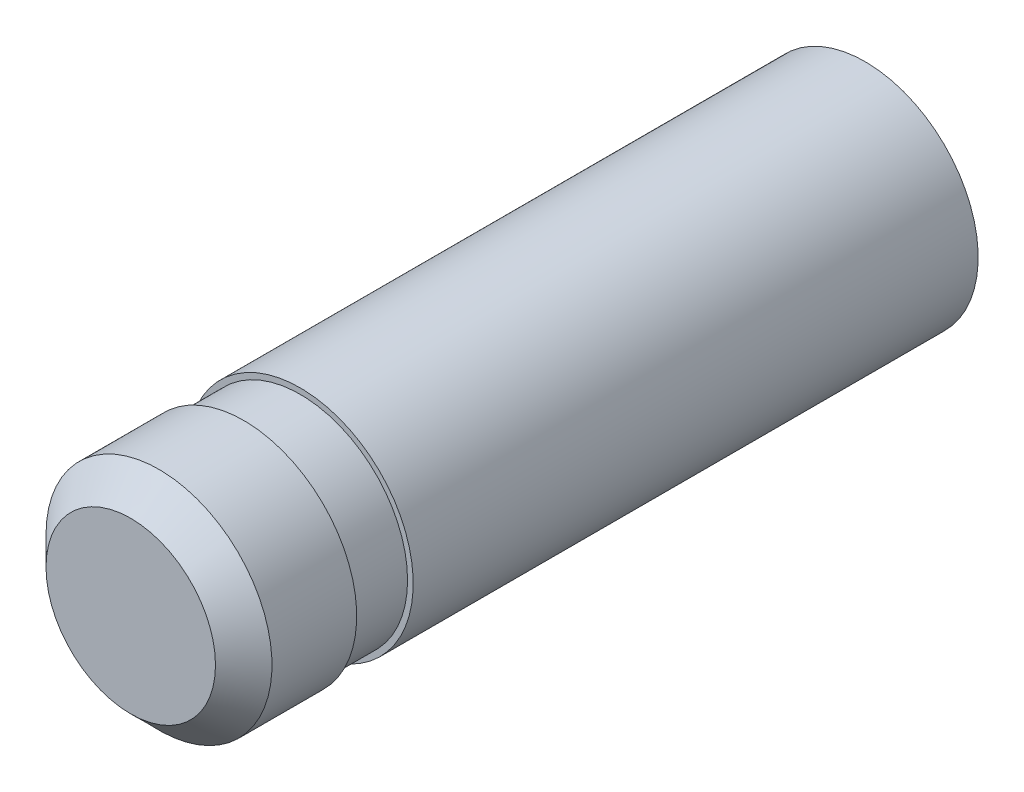
ISO-10303-21;
HEADER;
FILE_DESCRIPTION(('STEP AP214'),'2;1');
FILE_NAME('part.step','',(''),(''),'','','');
FILE_SCHEMA(('AUTOMOTIVE_DESIGN { 1 0 10303 214 1 1 1 1 }'));
ENDSEC;
DATA;
#1=APPLICATION_CONTEXT('core data for automotive mechanical design processes');
#2=APPLICATION_PROTOCOL_DEFINITION('international standard','automotive_design',2000,#1);
#3=PRODUCT_CONTEXT('',#1,'mechanical');
#4=PRODUCT('Part','Part','',(#3));
#5=PRODUCT_RELATED_PRODUCT_CATEGORY('part','',(#4));
#6=PRODUCT_DEFINITION_FORMATION('','',#4);
#7=PRODUCT_DEFINITION_CONTEXT('part definition',#1,'design');
#8=PRODUCT_DEFINITION('design','',#6,#7);
#9=PRODUCT_DEFINITION_SHAPE('','',#8);
#10=(LENGTH_UNIT() NAMED_UNIT(*) SI_UNIT(.MILLI.,.METRE.));
#11=(NAMED_UNIT(*) PLANE_ANGLE_UNIT() SI_UNIT($,.RADIAN.));
#12=(NAMED_UNIT(*) SI_UNIT($,.STERADIAN.) SOLID_ANGLE_UNIT());
#13=UNCERTAINTY_MEASURE_WITH_UNIT(LENGTH_MEASURE(1.E-05),#10,'distance_accuracy_value','');
#14=(GEOMETRIC_REPRESENTATION_CONTEXT(3) GLOBAL_UNCERTAINTY_ASSIGNED_CONTEXT((#13)) GLOBAL_UNIT_ASSIGNED_CONTEXT((#10,
#11,#12)) REPRESENTATION_CONTEXT('',''));
#15=CARTESIAN_POINT('',(0.,0.,0.));
#16=DIRECTION('',(0.,0.,1.));
#17=DIRECTION('',(1.,0.,0.));
#18=AXIS2_PLACEMENT_3D('',#15,#16,#17);
#19=CARTESIAN_POINT('',(0.,0.,16.2936060245675));
#20=DIRECTION('',(0.,0.,-1.));
#21=DIRECTION('',(-1.,0.,0.));
#22=AXIS2_PLACEMENT_3D('',#19,#20,#21);
#23=CYLINDRICAL_SURFACE('',#22,3.);
#24=CARTESIAN_POINT('',(0.,0.,15.5436060245675));
#25=DIRECTION('',(0.,0.,1.));
#26=DIRECTION('',(1.,0.,0.));
#27=AXIS2_PLACEMENT_3D('',#24,#25,#26);
#28=CIRCLE('',#27,3.);
#29=CARTESIAN_POINT('',(-3.,0.,15.5436060245675));
#30=VERTEX_POINT('',#29);
#31=EDGE_CURVE('E11',#30,#30,#28,.F.);
#32=CARTESIAN_POINT('',(0.,0.,13.2936060245675));
#33=DIRECTION('',(0.,0.,-1.));
#34=DIRECTION('',(-1.,0.,0.));
#35=AXIS2_PLACEMENT_3D('',#32,#33,#34);
#36=CIRCLE('',#35,3.);
#37=CARTESIAN_POINT('',(-3.,0.,13.2936060245675));
#38=VERTEX_POINT('',#37);
#39=EDGE_CURVE('E50',#38,#38,#36,.T.);
#40=CARTESIAN_POINT('',(-3.,0.,15.5436060245675));
#41=CARTESIAN_POINT('',(-3.,0.,15.5201685245675));
#42=CARTESIAN_POINT('',(-3.,0.,15.4967310245675));
#43=CARTESIAN_POINT('',(-3.,0.,15.4498560245675));
#44=CARTESIAN_POINT('',(-3.,0.,15.4264185245675));
#45=CARTESIAN_POINT('',(-3.,0.,15.3795435245675));
#46=CARTESIAN_POINT('',(-3.,0.,15.3561060245675));
#47=CARTESIAN_POINT('',(-3.,0.,15.3092310245675));
#48=CARTESIAN_POINT('',(-3.,0.,15.2857935245675));
#49=CARTESIAN_POINT('',(-3.,0.,15.2389185245675));
#50=CARTESIAN_POINT('',(-3.,0.,15.2154810245675));
#51=CARTESIAN_POINT('',(-3.,0.,15.1686060245675));
#52=CARTESIAN_POINT('',(-3.,0.,15.1451685245675));
#53=CARTESIAN_POINT('',(-3.,0.,15.0982935245675));
#54=CARTESIAN_POINT('',(-3.,0.,15.0748560245675));
#55=CARTESIAN_POINT('',(-3.,0.,15.0279810245675));
#56=CARTESIAN_POINT('',(-3.,0.,15.0045435245675));
#57=CARTESIAN_POINT('',(-3.,0.,14.9576685245675));
#58=CARTESIAN_POINT('',(-3.,0.,14.9342310245675));
#59=CARTESIAN_POINT('',(-3.,0.,14.8873560245675));
#60=CARTESIAN_POINT('',(-3.,0.,14.8639185245675));
#61=CARTESIAN_POINT('',(-3.,0.,14.8170435245675));
#62=CARTESIAN_POINT('',(-3.,0.,14.7936060245675));
#63=CARTESIAN_POINT('',(-3.,0.,14.7467310245675));
#64=CARTESIAN_POINT('',(-3.,0.,14.7232935245675));
#65=CARTESIAN_POINT('',(-3.,0.,14.6764185245675));
#66=CARTESIAN_POINT('',(-3.,0.,14.6529810245675));
#67=CARTESIAN_POINT('',(-3.,0.,14.6061060245675));
#68=CARTESIAN_POINT('',(-3.,0.,14.5826685245675));
#69=CARTESIAN_POINT('',(-3.,0.,14.5357935245675));
#70=CARTESIAN_POINT('',(-3.,0.,14.5123560245675));
#71=CARTESIAN_POINT('',(-3.,0.,14.4654810245675));
#72=CARTESIAN_POINT('',(-3.,0.,14.4420435245675));
#73=CARTESIAN_POINT('',(-3.,0.,14.3951685245675));
#74=CARTESIAN_POINT('',(-3.,0.,14.3717310245675));
#75=CARTESIAN_POINT('',(-3.,0.,14.3248560245675));
#76=CARTESIAN_POINT('',(-3.,0.,14.3014185245675));
#77=CARTESIAN_POINT('',(-3.,0.,14.2545435245675));
#78=CARTESIAN_POINT('',(-3.,0.,14.2311060245675));
#79=CARTESIAN_POINT('',(-3.,0.,14.1842310245675));
#80=CARTESIAN_POINT('',(-3.,0.,14.1607935245675));
#81=CARTESIAN_POINT('',(-3.,0.,14.1139185245675));
#82=CARTESIAN_POINT('',(-3.,0.,14.0904810245675));
#83=CARTESIAN_POINT('',(-3.,0.,14.0436060245675));
#84=CARTESIAN_POINT('',(-3.,0.,14.0201685245675));
#85=CARTESIAN_POINT('',(-3.,0.,13.9732935245675));
#86=CARTESIAN_POINT('',(-3.,0.,13.9498560245675));
#87=CARTESIAN_POINT('',(-3.,0.,13.9029810245675));
#88=CARTESIAN_POINT('',(-3.,0.,13.8795435245675));
#89=CARTESIAN_POINT('',(-3.,0.,13.8326685245675));
#90=CARTESIAN_POINT('',(-3.,0.,13.8092310245675));
#91=CARTESIAN_POINT('',(-3.,0.,13.7623560245675));
#92=CARTESIAN_POINT('',(-3.,0.,13.7389185245675));
#93=CARTESIAN_POINT('',(-3.,0.,13.6920435245675));
#94=CARTESIAN_POINT('',(-3.,0.,13.6686060245675));
#95=CARTESIAN_POINT('',(-3.,0.,13.6217310245675));
#96=CARTESIAN_POINT('',(-3.,0.,13.5982935245675));
#97=CARTESIAN_POINT('',(-3.,0.,13.5514185245675));
#98=CARTESIAN_POINT('',(-3.,0.,13.5279810245675));
#99=CARTESIAN_POINT('',(-3.,0.,13.4811060245675));
#100=CARTESIAN_POINT('',(-3.,0.,13.4576685245675));
#101=CARTESIAN_POINT('',(-3.,0.,13.4107935245675));
#102=CARTESIAN_POINT('',(-3.,0.,13.3873560245675));
#103=CARTESIAN_POINT('',(-3.,0.,13.3404810245675));
#104=CARTESIAN_POINT('',(-3.,0.,13.3170435245675));
#105=CARTESIAN_POINT('',(-3.,0.,13.2936060245675));
#106=B_SPLINE_CURVE_WITH_KNOTS('',3,(#40,#41,#42,#43,#44,#45,#46,#47,#48,#49,#50,#51,#52,#53,
#54,#55,#56,#57,#58,#59,#60,#61,#62,#63,#64,#65,#66,#67,#68,#69,#70,#71,#72,#73,#74,#75,#76,#77,
#78,#79,#80,#81,#82,#83,#84,#85,#86,#87,#88,#89,#90,#91,#92,#93,#94,#95,#96,#97,#98,#99,#100,
#101,#102,#103,#104,#105),.UNSPECIFIED.,.F.,.F.,(4,2,2,2,2,2,2,2,2,2,2,2,2,2,2,2,2,2,2,2,2,2,2,
2,2,2,2,2,2,2,2,2,4),(0.,0.0703124999999992,0.140625,0.210937499999999,0.28125,
0.351562499999999,0.421875,0.4921875,0.5625,0.6328125,0.703125000000001,0.7734375,
0.843750000000001,0.9140625,0.984375000000001,1.0546875,1.125,1.1953125,1.265625,1.3359375,
1.40625,1.4765625,1.546875,1.6171875,1.6875,1.7578125,1.828125,1.8984375,1.96875,2.0390625,
2.109375,2.1796875,2.25),.UNSPECIFIED.);
#107=EDGE_CURVE('BSEAM35',#30,#38,#106,.T.);
#108=ORIENTED_EDGE('',*,*,#31,.T.);
#109=ORIENTED_EDGE('',*,*,#39,.F.);
#110=ORIENTED_EDGE('',*,*,#107,.T.);
#111=ORIENTED_EDGE('',*,*,#107,.F.);
#112=EDGE_LOOP('',(#108,#110,#109,#111));
#113=FACE_BOUND('',#112,.T.);
#114=ADVANCED_FACE('F35',(#113),#23,.T.);
#115=CARTESIAN_POINT('',(0.,0.,16.2936060245675));
#116=DIRECTION('',(0.,0.,1.));
#117=DIRECTION('',(1.,0.,0.));
#118=AXIS2_PLACEMENT_3D('',#115,#116,#117);
#119=PLANE('',#118);
#120=CARTESIAN_POINT('',(0.,0.,16.2936060245675));
#121=DIRECTION('',(0.,0.,1.));
#122=DIRECTION('',(1.,0.,0.));
#123=AXIS2_PLACEMENT_3D('',#120,#121,#122);
#124=CIRCLE('',#123,2.25000000000001);
#125=CARTESIAN_POINT('',(2.25000000000001,0.,16.2936060245675));
#126=VERTEX_POINT('',#125);
#127=EDGE_CURVE('E42',#126,#126,#124,.T.);
#128=ORIENTED_EDGE('',*,*,#127,.T.);
#129=EDGE_LOOP('',(#128));
#130=FACE_BOUND('',#129,.T.);
#131=ADVANCED_FACE('F72',(#130),#119,.T.);
#132=CARTESIAN_POINT('',(0.,0.,13.2936060245675));
#133=DIRECTION('',(0.,0.,-1.));
#134=DIRECTION('',(-1.,0.,0.));
#135=AXIS2_PLACEMENT_3D('',#132,#133,#134);
#136=PLANE('',#135);
#137=CARTESIAN_POINT('',(0.,0.,13.2936060245675));
#138=DIRECTION('',(0.,0.,-1.));
#139=DIRECTION('',(-1.,0.,0.));
#140=AXIS2_PLACEMENT_3D('',#137,#138,#139);
#141=CIRCLE('',#140,2.85);
#142=CARTESIAN_POINT('',(-2.85,0.,13.2936060245675));
#143=VERTEX_POINT('',#142);
#144=EDGE_CURVE('E57',#143,#143,#141,.T.);
#145=ORIENTED_EDGE('',*,*,#144,.F.);
#146=EDGE_LOOP('',(#145));
#147=FACE_BOUND('',#146,.T.);
#148=ORIENTED_EDGE('',*,*,#39,.T.);
#149=EDGE_LOOP('',(#148));
#150=FACE_BOUND('',#149,.T.);
#151=ADVANCED_FACE('F68',(#147,#150),#136,.T.);
#152=CARTESIAN_POINT('',(0.,0.,11.7936060245675));
#153=DIRECTION('',(0.,0.,-1.));
#154=DIRECTION('',(-1.,0.,0.));
#155=AXIS2_PLACEMENT_3D('',#152,#153,#154);
#156=PLANE('',#155);
#157=CARTESIAN_POINT('',(0.,0.,11.7936060245675));
#158=DIRECTION('',(0.,0.,-1.));
#159=DIRECTION('',(-1.,0.,0.));
#160=AXIS2_PLACEMENT_3D('',#157,#158,#159);
#161=CIRCLE('',#160,2.85);
#162=CARTESIAN_POINT('',(-2.85,0.,11.7936060245675));
#163=VERTEX_POINT('',#162);
#164=EDGE_CURVE('E59',#163,#163,#161,.T.);
#165=ORIENTED_EDGE('',*,*,#164,.T.);
#166=EDGE_LOOP('',(#165));
#167=FACE_BOUND('',#166,.T.);
#168=CARTESIAN_POINT('',(0.,0.,11.7936060245675));
#169=DIRECTION('',(0.,0.,-1.));
#170=DIRECTION('',(-1.,0.,0.));
#171=AXIS2_PLACEMENT_3D('',#168,#169,#170);
#172=CIRCLE('',#171,3.);
#173=CARTESIAN_POINT('',(-3.,0.,11.7936060245675));
#174=VERTEX_POINT('',#173);
#175=EDGE_CURVE('E55',#174,#174,#172,.T.);
#176=ORIENTED_EDGE('',*,*,#175,.F.);
#177=EDGE_LOOP('',(#176));
#178=FACE_BOUND('',#177,.T.);
#179=ADVANCED_FACE('F71',(#167,#178),#156,.F.);
#180=CARTESIAN_POINT('',(0.,0.,13.2936060245675));
#181=DIRECTION('',(0.,0.,-1.));
#182=DIRECTION('',(-1.,0.,0.));
#183=AXIS2_PLACEMENT_3D('',#180,#181,#182);
#184=CYLINDRICAL_SURFACE('',#183,2.85);
#185=ORIENTED_EDGE('',*,*,#144,.T.);
#186=EDGE_LOOP('',(#185));
#187=FACE_BOUND('',#186,.T.);
#188=ORIENTED_EDGE('',*,*,#164,.F.);
#189=EDGE_LOOP('',(#188));
#190=FACE_BOUND('',#189,.T.);
#191=ADVANCED_FACE('F65',(#187,#190),#184,.T.);
#192=CARTESIAN_POINT('',(0.,0.,-3.20639397543254));
#193=DIRECTION('',(0.,0.,1.));
#194=DIRECTION('',(1.,0.,0.));
#195=AXIS2_PLACEMENT_3D('',#192,#193,#194);
#196=PLANE('',#195);
#197=CARTESIAN_POINT('',(0.,0.,-3.20639397543254));
#198=DIRECTION('',(0.,0.,1.));
#199=DIRECTION('',(1.,0.,0.));
#200=AXIS2_PLACEMENT_3D('',#197,#198,#199);
#201=CIRCLE('',#200,3.);
#202=CARTESIAN_POINT('',(-3.,0.,-3.20639397543254));
#203=VERTEX_POINT('',#202);
#204=EDGE_CURVE('E46',#203,#203,#201,.T.);
#205=ORIENTED_EDGE('',*,*,#204,.F.);
#206=EDGE_LOOP('',(#205));
#207=FACE_BOUND('',#206,.T.);
#208=ADVANCED_FACE('F84',(#207),#196,.F.);
#209=CARTESIAN_POINT('',(-3.,0.,11.7936060245675));
#210=CARTESIAN_POINT('',(-3.,0.,11.6373560245675));
#211=CARTESIAN_POINT('',(-3.,0.,11.4811060245675));
#212=CARTESIAN_POINT('',(-3.,0.,11.1686060245675));
#213=CARTESIAN_POINT('',(-3.,0.,11.0123560245675));
#214=CARTESIAN_POINT('',(-3.,0.,10.6998560245675));
#215=CARTESIAN_POINT('',(-3.,0.,10.5436060245675));
#216=CARTESIAN_POINT('',(-3.,0.,10.2311060245675));
#217=CARTESIAN_POINT('',(-3.,0.,10.0748560245675));
#218=CARTESIAN_POINT('',(-3.,0.,9.76235602456746));
#219=CARTESIAN_POINT('',(-3.,0.,9.60610602456746));
#220=CARTESIAN_POINT('',(-3.,0.,9.29360602456746));
#221=CARTESIAN_POINT('',(-3.,0.,9.13735602456746));
#222=CARTESIAN_POINT('',(-3.,0.,8.82485602456746));
#223=CARTESIAN_POINT('',(-3.,0.,8.66860602456746));
#224=CARTESIAN_POINT('',(-3.,0.,8.35610602456746));
#225=CARTESIAN_POINT('',(-3.,0.,8.19985602456746));
#226=CARTESIAN_POINT('',(-3.,0.,7.88735602456746));
#227=CARTESIAN_POINT('',(-3.,0.,7.73110602456746));
#228=CARTESIAN_POINT('',(-3.,0.,7.41860602456746));
#229=CARTESIAN_POINT('',(-3.,0.,7.26235602456746));
#230=CARTESIAN_POINT('',(-3.,0.,6.94985602456746));
#231=CARTESIAN_POINT('',(-3.,0.,6.79360602456746));
#232=CARTESIAN_POINT('',(-3.,0.,6.48110602456746));
#233=CARTESIAN_POINT('',(-3.,0.,6.32485602456746));
#234=CARTESIAN_POINT('',(-3.,0.,6.01235602456746));
#235=CARTESIAN_POINT('',(-3.,0.,5.85610602456746));
#236=CARTESIAN_POINT('',(-3.,0.,5.54360602456746));
#237=CARTESIAN_POINT('',(-3.,0.,5.38735602456746));
#238=CARTESIAN_POINT('',(-3.,0.,5.07485602456746));
#239=CARTESIAN_POINT('',(-3.,0.,4.91860602456746));
#240=CARTESIAN_POINT('',(-3.,0.,4.60610602456746));
#241=CARTESIAN_POINT('',(-3.,0.,4.44985602456746));
#242=CARTESIAN_POINT('',(-3.,0.,4.13735602456746));
#243=CARTESIAN_POINT('',(-3.,0.,3.98110602456746));
#244=CARTESIAN_POINT('',(-3.,0.,3.66860602456746));
#245=CARTESIAN_POINT('',(-3.,0.,3.51235602456746));
#246=CARTESIAN_POINT('',(-3.,0.,3.19985602456746));
#247=CARTESIAN_POINT('',(-3.,0.,3.04360602456746));
#248=CARTESIAN_POINT('',(-3.,0.,2.73110602456746));
#249=CARTESIAN_POINT('',(-3.,0.,2.57485602456746));
#250=CARTESIAN_POINT('',(-3.,0.,2.26235602456746));
#251=CARTESIAN_POINT('',(-3.,0.,2.10610602456746));
#252=CARTESIAN_POINT('',(-3.,0.,1.79360602456746));
#253=CARTESIAN_POINT('',(-3.,0.,1.63735602456746));
#254=CARTESIAN_POINT('',(-3.,0.,1.32485602456746));
#255=CARTESIAN_POINT('',(-3.,0.,1.16860602456746));
#256=CARTESIAN_POINT('',(-3.,0.,0.856106024567463));
#257=CARTESIAN_POINT('',(-3.,0.,0.699856024567464));
#258=CARTESIAN_POINT('',(-3.,0.,0.387356024567463));
#259=CARTESIAN_POINT('',(-3.,0.,0.231106024567462));
#260=CARTESIAN_POINT('',(-3.,0.,-0.0813939754325382));
#261=CARTESIAN_POINT('',(-3.,0.,-0.237643975432537));
#262=CARTESIAN_POINT('',(-3.,0.,-0.550143975432537));
#263=CARTESIAN_POINT('',(-3.,0.,-0.706393975432539));
#264=CARTESIAN_POINT('',(-3.,0.,-1.01889397543254));
#265=CARTESIAN_POINT('',(-3.,0.,-1.17514397543254));
#266=CARTESIAN_POINT('',(-3.,0.,-1.48764397543254));
#267=CARTESIAN_POINT('',(-3.,0.,-1.64389397543254));
#268=CARTESIAN_POINT('',(-3.,0.,-1.95639397543254));
#269=CARTESIAN_POINT('',(-3.,0.,-2.11264397543254));
#270=CARTESIAN_POINT('',(-3.,0.,-2.42514397543254));
#271=CARTESIAN_POINT('',(-3.,0.,-2.58139397543254));
#272=CARTESIAN_POINT('',(-3.,0.,-2.89389397543254));
#273=CARTESIAN_POINT('',(-3.,0.,-3.05014397543254));
#274=CARTESIAN_POINT('',(-3.,0.,-3.20639397543254));
#275=B_SPLINE_CURVE_WITH_KNOTS('',3,(#209,#210,#211,#212,#213,#214,#215,#216,#217,#218,#219,
#220,#221,#222,#223,#224,#225,#226,#227,#228,#229,#230,#231,#232,#233,#234,#235,#236,#237,#238,
#239,#240,#241,#242,#243,#244,#245,#246,#247,#248,#249,#250,#251,#252,#253,#254,#255,#256,#257,
#258,#259,#260,#261,#262,#263,#264,#265,#266,#267,#268,#269,#270,#271,#272,#273,#274),
.UNSPECIFIED.,.F.,.F.,(4,2,2,2,2,2,2,2,2,2,2,2,2,2,2,2,2,2,2,2,2,2,2,2,2,2,2,2,2,2,2,2,4),(0.,
0.46875,0.937500000000001,1.40625,1.875,2.34375,2.8125,3.28125,3.75,4.21875,4.6875,5.15625,
5.625,6.09375,6.5625,7.03125,7.5,7.96875,8.4375,8.90625,9.375,9.84375,10.3125,10.78125,11.25,
11.71875,12.1875,12.65625,13.125,13.59375,14.0625,14.53125,15.),.UNSPECIFIED.);
#276=EDGE_CURVE('BSEAM77',#174,#203,#275,.T.);
#277=ORIENTED_EDGE('',*,*,#175,.T.);
#278=ORIENTED_EDGE('',*,*,#204,.T.);
#279=ORIENTED_EDGE('',*,*,#276,.T.);
#280=ORIENTED_EDGE('',*,*,#276,.F.);
#281=EDGE_LOOP('',(#277,#279,#278,#280));
#282=FACE_BOUND('',#281,.T.);
#283=ADVANCED_FACE('F77',(#282),#23,.T.);
#284=CARTESIAN_POINT('',(0.,0.,16.2936060245675));
#285=DIRECTION('',(0.,0.,-1.));
#286=DIRECTION('',(-1.,0.,0.));
#287=AXIS2_PLACEMENT_3D('',#284,#285,#286);
#288=CONICAL_SURFACE('',#287,2.25000000000001,0.785398163397447);
#289=ORIENTED_EDGE('',*,*,#31,.F.);
#290=EDGE_LOOP('',(#289));
#291=FACE_BOUND('',#290,.T.);
#292=ORIENTED_EDGE('',*,*,#127,.F.);
#293=EDGE_LOOP('',(#292));
#294=FACE_BOUND('',#293,.T.);
#295=ADVANCED_FACE('F37',(#291,#294),#288,.T.);
#296=CLOSED_SHELL('',(#114,#131,#151,#179,#191,#208,#283,#295));
#297=MANIFOLD_SOLID_BREP('B2',#296);
#298=ADVANCED_BREP_SHAPE_REPRESENTATION('',(#18,#297),#14);
#299=SHAPE_DEFINITION_REPRESENTATION(#9,#298);
ENDSEC;
END-ISO-10303-21;
